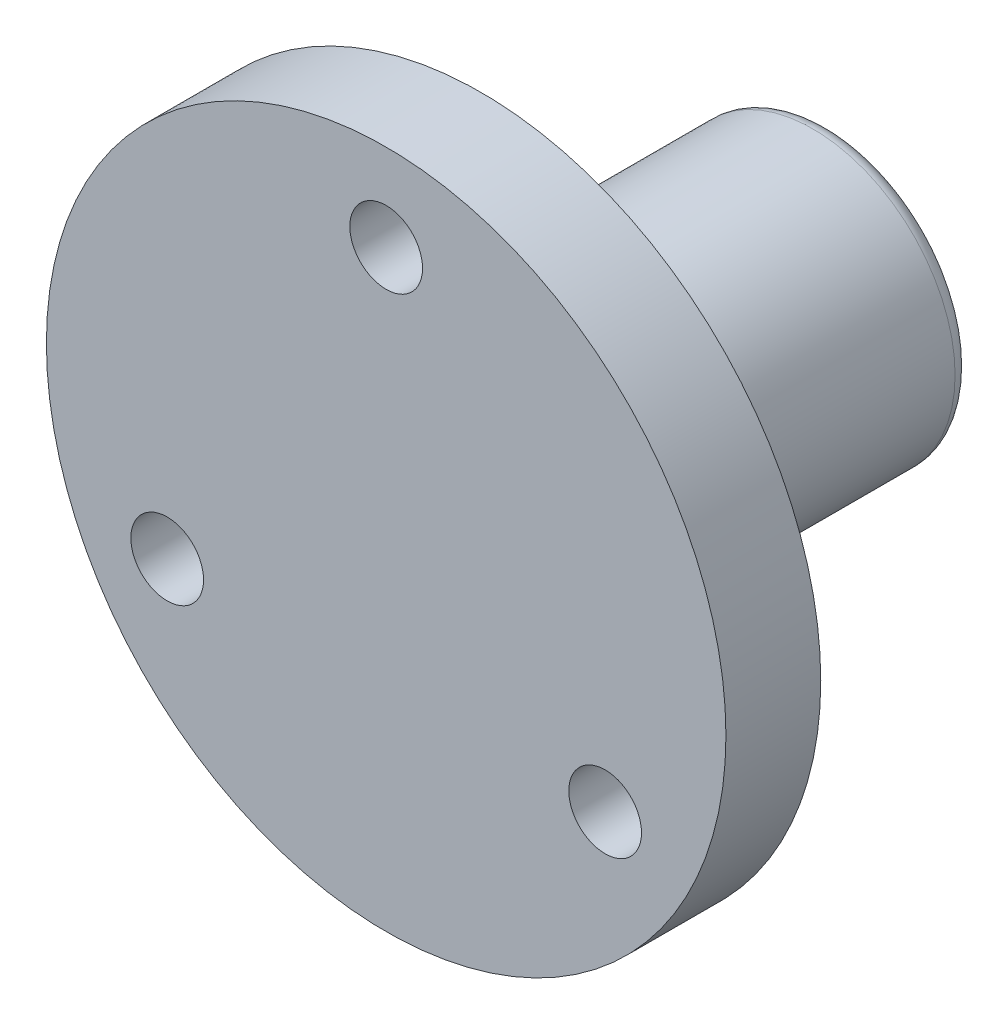
ISO-10303-21;
HEADER;
FILE_DESCRIPTION(('STEP AP214'),'2;1');
FILE_NAME('part.step','',(''),(''),'','','');
FILE_SCHEMA(('AUTOMOTIVE_DESIGN { 1 0 10303 214 1 1 1 1 }'));
ENDSEC;
DATA;
#1=APPLICATION_CONTEXT('core data for automotive mechanical design processes');
#2=APPLICATION_PROTOCOL_DEFINITION('international standard','automotive_design',2000,#1);
#3=PRODUCT_CONTEXT('',#1,'mechanical');
#4=PRODUCT('Part','Part','',(#3));
#5=PRODUCT_RELATED_PRODUCT_CATEGORY('part','',(#4));
#6=PRODUCT_DEFINITION_FORMATION('','',#4);
#7=PRODUCT_DEFINITION_CONTEXT('part definition',#1,'design');
#8=PRODUCT_DEFINITION('design','',#6,#7);
#9=PRODUCT_DEFINITION_SHAPE('','',#8);
#10=(LENGTH_UNIT() NAMED_UNIT(*) SI_UNIT(.MILLI.,.METRE.));
#11=(NAMED_UNIT(*) PLANE_ANGLE_UNIT() SI_UNIT($,.RADIAN.));
#12=(NAMED_UNIT(*) SI_UNIT($,.STERADIAN.) SOLID_ANGLE_UNIT());
#13=UNCERTAINTY_MEASURE_WITH_UNIT(LENGTH_MEASURE(1.E-05),#10,'distance_accuracy_value','');
#14=(GEOMETRIC_REPRESENTATION_CONTEXT(3) GLOBAL_UNCERTAINTY_ASSIGNED_CONTEXT((#13)) GLOBAL_UNIT_ASSIGNED_CONTEXT((#10,
#11,#12)) REPRESENTATION_CONTEXT('',''));
#15=CARTESIAN_POINT('',(0.,0.,0.));
#16=DIRECTION('',(0.,0.,1.));
#17=DIRECTION('',(1.,0.,0.));
#18=AXIS2_PLACEMENT_3D('',#15,#16,#17);
#19=CARTESIAN_POINT('',(26.8532032302755,-11.,3.));
#20=DIRECTION('',(0.,0.,-1.));
#21=DIRECTION('',(-1.,0.,0.));
#22=AXIS2_PLACEMENT_3D('',#19,#20,#21);
#23=CYLINDRICAL_SURFACE('',#22,1.15);
#24=CARTESIAN_POINT('',(26.8532032302755,-11.,3.));
#25=DIRECTION('',(0.,0.,1.));
#26=DIRECTION('',(1.,0.,0.));
#27=AXIS2_PLACEMENT_3D('',#24,#25,#26);
#28=CIRCLE('',#27,1.15);
#29=CARTESIAN_POINT('',(28.0032032302755,-11.,3.));
#30=VERTEX_POINT('',#29);
#31=EDGE_CURVE('E386',#30,#30,#28,.T.);
#32=ORIENTED_EDGE('',*,*,#31,.T.);
#33=EDGE_LOOP('',(#32));
#34=FACE_BOUND('',#33,.T.);
#35=CARTESIAN_POINT('',(26.8532032302755,-11.,1.));
#36=DIRECTION('',(0.,0.,-1.));
#37=DIRECTION('',(-1.,0.,0.));
#38=AXIS2_PLACEMENT_3D('',#35,#36,#37);
#39=CIRCLE('',#38,1.15);
#40=CARTESIAN_POINT('',(25.7032032302755,-11.,1.));
#41=VERTEX_POINT('',#40);
#42=EDGE_CURVE('E391',#41,#41,#39,.T.);
#43=ORIENTED_EDGE('',*,*,#42,.T.);
#44=EDGE_LOOP('',(#43));
#45=FACE_BOUND('',#44,.T.);
#46=ADVANCED_FACE('F45',(#34,#45),#23,.F.);
#47=CARTESIAN_POINT('',(19.925,0.99999999999999,3.));
#48=DIRECTION('',(0.,0.,-1.));
#49=DIRECTION('',(-1.,0.,0.));
#50=AXIS2_PLACEMENT_3D('',#47,#48,#49);
#51=CYLINDRICAL_SURFACE('',#50,1.15);
#52=CARTESIAN_POINT('',(19.925,0.99999999999999,3.));
#53=DIRECTION('',(0.,0.,1.));
#54=DIRECTION('',(1.,0.,0.));
#55=AXIS2_PLACEMENT_3D('',#52,#53,#54);
#56=CIRCLE('',#55,1.15);
#57=CARTESIAN_POINT('',(21.075,0.99999999999999,3.));
#58=VERTEX_POINT('',#57);
#59=EDGE_CURVE('E390',#58,#58,#56,.T.);
#60=ORIENTED_EDGE('',*,*,#59,.T.);
#61=EDGE_LOOP('',(#60));
#62=FACE_BOUND('',#61,.T.);
#63=CARTESIAN_POINT('',(19.925,0.99999999999999,1.));
#64=DIRECTION('',(0.,0.,-1.));
#65=DIRECTION('',(-1.,0.,0.));
#66=AXIS2_PLACEMENT_3D('',#63,#64,#65);
#67=CIRCLE('',#66,1.15);
#68=CARTESIAN_POINT('',(18.775,0.99999999999999,1.));
#69=VERTEX_POINT('',#68);
#70=EDGE_CURVE('E435',#69,#69,#67,.T.);
#71=ORIENTED_EDGE('',*,*,#70,.T.);
#72=EDGE_LOOP('',(#71));
#73=FACE_BOUND('',#72,.T.);
#74=ADVANCED_FACE('F464',(#62,#73),#51,.F.);
#75=CARTESIAN_POINT('',(12.9967967697245,-11.,3.));
#76=DIRECTION('',(0.,0.,-1.));
#77=DIRECTION('',(-1.,0.,0.));
#78=AXIS2_PLACEMENT_3D('',#75,#76,#77);
#79=CYLINDRICAL_SURFACE('',#78,1.15);
#80=CARTESIAN_POINT('',(12.9967967697245,-11.,3.));
#81=DIRECTION('',(0.,0.,1.));
#82=DIRECTION('',(1.,0.,0.));
#83=AXIS2_PLACEMENT_3D('',#80,#81,#82);
#84=CIRCLE('',#83,1.15);
#85=CARTESIAN_POINT('',(14.1467967697245,-11.,3.));
#86=VERTEX_POINT('',#85);
#87=EDGE_CURVE('E395',#86,#86,#84,.T.);
#88=ORIENTED_EDGE('',*,*,#87,.T.);
#89=EDGE_LOOP('',(#88));
#90=FACE_BOUND('',#89,.T.);
#91=CARTESIAN_POINT('',(12.9967967697245,-11.,1.));
#92=DIRECTION('',(0.,0.,-1.));
#93=DIRECTION('',(-1.,0.,0.));
#94=AXIS2_PLACEMENT_3D('',#91,#92,#93);
#95=CIRCLE('',#94,1.15);
#96=CARTESIAN_POINT('',(11.8467967697245,-11.,1.));
#97=VERTEX_POINT('',#96);
#98=EDGE_CURVE('E244',#97,#97,#95,.T.);
#99=ORIENTED_EDGE('',*,*,#98,.T.);
#100=EDGE_LOOP('',(#99));
#101=FACE_BOUND('',#100,.T.);
#102=ADVANCED_FACE('F470',(#90,#101),#79,.F.);
#103=CARTESIAN_POINT('',(19.925,-7.00000000000001,-11.));
#104=DIRECTION('',(0.,0.,1.));
#105=DIRECTION('',(1.,0.,0.));
#106=AXIS2_PLACEMENT_3D('',#103,#104,#105);
#107=CYLINDRICAL_SURFACE('',#106,4.5);
#108=CARTESIAN_POINT('',(19.925,-7.00000000000001,-10.5));
#109=DIRECTION('',(0.,0.,1.));
#110=DIRECTION('',(1.,0.,0.));
#111=AXIS2_PLACEMENT_3D('',#108,#109,#110);
#112=CIRCLE('',#111,4.5);
#113=CARTESIAN_POINT('',(24.425,-7.00000000000001,-10.5));
#114=VERTEX_POINT('',#113);
#115=EDGE_CURVE('E54',#114,#114,#112,.T.);
#116=ORIENTED_EDGE('',*,*,#115,.T.);
#117=EDGE_LOOP('',(#116));
#118=FACE_BOUND('',#117,.T.);
#119=CARTESIAN_POINT('',(19.925,-7.00000000000001,-0.999999999999994));
#120=DIRECTION('',(0.,0.,1.));
#121=DIRECTION('',(1.,0.,0.));
#122=AXIS2_PLACEMENT_3D('',#119,#120,#121);
#123=CIRCLE('',#122,4.5);
#124=CARTESIAN_POINT('',(24.425,-7.00000000000001,-0.999999999999994));
#125=VERTEX_POINT('',#124);
#126=EDGE_CURVE('E445',#125,#125,#123,.F.);
#127=ORIENTED_EDGE('',*,*,#126,.T.);
#128=EDGE_LOOP('',(#127));
#129=FACE_BOUND('',#128,.T.);
#130=ADVANCED_FACE('F452',(#118,#129),#107,.T.);
#131=CARTESIAN_POINT('',(19.925,-7.00000000000001,-11.));
#132=DIRECTION('',(0.,0.,1.));
#133=DIRECTION('',(1.,0.,0.));
#134=AXIS2_PLACEMENT_3D('',#131,#132,#133);
#135=PLANE('',#134);
#136=CARTESIAN_POINT('',(19.925,-7.00000000000001,-11.));
#137=DIRECTION('',(0.,0.,1.));
#138=DIRECTION('',(1.,0.,0.));
#139=AXIS2_PLACEMENT_3D('',#136,#137,#138);
#140=CIRCLE('',#139,4.);
#141=CARTESIAN_POINT('',(23.925,-7.00000000000001,-11.));
#142=VERTEX_POINT('',#141);
#143=EDGE_CURVE('E11',#142,#142,#140,.F.);
#144=ORIENTED_EDGE('',*,*,#143,.T.);
#145=EDGE_LOOP('',(#144));
#146=FACE_BOUND('',#145,.T.);
#147=DIRECTION('',(-1.,0.,0.));
#148=VECTOR('',#147,1.);
#149=CARTESIAN_POINT('',(18.1469868813107,-4.58366613445726,-11.));
#150=LINE('',#149,#148);
#151=CARTESIAN_POINT('',(21.7030131186893,-4.58366613445726,-11.));
#152=VERTEX_POINT('',#151);
#153=CARTESIAN_POINT('',(18.1469868813107,-4.58366613445726,-11.));
#154=VERTEX_POINT('',#153);
#155=EDGE_CURVE('E412',#152,#154,#150,.T.);
#156=ORIENTED_EDGE('',*,*,#155,.T.);
#157=CARTESIAN_POINT('',(19.925,-7.00000000000001,-11.));
#158=DIRECTION('',(0.,0.,1.));
#159=DIRECTION('',(1.,0.,0.));
#160=AXIS2_PLACEMENT_3D('',#157,#158,#159);
#161=CIRCLE('',#160,3.);
#162=EDGE_CURVE('E408',#154,#152,#161,.T.);
#163=ORIENTED_EDGE('',*,*,#162,.T.);
#164=EDGE_LOOP('',(#156,#163));
#165=FACE_BOUND('',#164,.T.);
#166=ADVANCED_FACE('F501',(#146,#165),#135,.F.);
#167=CARTESIAN_POINT('',(19.925,-7.00000000000001,-11.));
#168=DIRECTION('',(0.,0.,1.));
#169=DIRECTION('',(1.,0.,0.));
#170=AXIS2_PLACEMENT_3D('',#167,#168,#169);
#171=CYLINDRICAL_SURFACE('',#170,3.);
#172=CARTESIAN_POINT('',(19.925,-7.00000000000001,0.));
#173=DIRECTION('',(0.,0.,1.));
#174=DIRECTION('',(1.,0.,0.));
#175=AXIS2_PLACEMENT_3D('',#172,#173,#174);
#176=CIRCLE('',#175,3.);
#177=CARTESIAN_POINT('',(18.1469868813107,-4.58366613445726,0.));
#178=VERTEX_POINT('',#177);
#179=CARTESIAN_POINT('',(21.7030131186893,-4.58366613445726,0.));
#180=VERTEX_POINT('',#179);
#181=EDGE_CURVE('E404',#178,#180,#176,.T.);
#182=ORIENTED_EDGE('',*,*,#181,.T.);
#183=DIRECTION('',(0.,0.,1.));
#184=VECTOR('',#183,1.);
#185=CARTESIAN_POINT('',(21.7030131186893,-4.58366613445726,-11.));
#186=LINE('',#185,#184);
#187=EDGE_CURVE('E417',#152,#180,#186,.T.);
#188=ORIENTED_EDGE('',*,*,#187,.F.);
#189=ORIENTED_EDGE('',*,*,#162,.F.);
#190=DIRECTION('',(0.,0.,1.));
#191=VECTOR('',#190,1.);
#192=CARTESIAN_POINT('',(18.1469868813107,-4.58366613445726,-11.));
#193=LINE('',#192,#191);
#194=EDGE_CURVE('E424',#154,#178,#193,.T.);
#195=ORIENTED_EDGE('',*,*,#194,.T.);
#196=EDGE_LOOP('',(#182,#188,#189,#195));
#197=FACE_BOUND('',#196,.T.);
#198=ADVANCED_FACE('F497',(#197),#171,.F.);
#199=CARTESIAN_POINT('',(18.1469868813107,-4.58366613445726,-11.));
#200=DIRECTION('',(0.,1.,0.));
#201=DIRECTION('',(-1.,0.,0.));
#202=AXIS2_PLACEMENT_3D('',#199,#200,#201);
#203=PLANE('',#202);
#204=DIRECTION('',(-1.,0.,0.));
#205=VECTOR('',#204,1.);
#206=CARTESIAN_POINT('',(18.1469868813107,-4.58366613445726,0.));
#207=LINE('',#206,#205);
#208=EDGE_CURVE('E413',#180,#178,#207,.T.);
#209=ORIENTED_EDGE('',*,*,#208,.T.);
#210=ORIENTED_EDGE('',*,*,#194,.F.);
#211=ORIENTED_EDGE('',*,*,#155,.F.);
#212=ORIENTED_EDGE('',*,*,#187,.T.);
#213=EDGE_LOOP('',(#209,#210,#211,#212));
#214=FACE_BOUND('',#213,.T.);
#215=ADVANCED_FACE('F493',(#214),#203,.F.);
#216=CARTESIAN_POINT('',(19.925,-7.00000000000001,3.));
#217=DIRECTION('',(0.,0.,-1.));
#218=DIRECTION('',(-1.,0.,0.));
#219=AXIS2_PLACEMENT_3D('',#216,#217,#218);
#220=CYLINDRICAL_SURFACE('',#219,10.75);
#221=CARTESIAN_POINT('',(19.925,-7.00000000000001,3.));
#222=DIRECTION('',(0.,0.,1.));
#223=DIRECTION('',(1.,0.,0.));
#224=AXIS2_PLACEMENT_3D('',#221,#222,#223);
#225=CIRCLE('',#224,10.75);
#226=CARTESIAN_POINT('',(30.675,-7.00000000000001,3.));
#227=VERTEX_POINT('',#226);
#228=EDGE_CURVE('E400',#227,#227,#225,.T.);
#229=ORIENTED_EDGE('',*,*,#228,.F.);
#230=EDGE_LOOP('',(#229));
#231=FACE_BOUND('',#230,.T.);
#232=CARTESIAN_POINT('',(19.925,-7.00000000000001,0.));
#233=DIRECTION('',(0.,0.,1.));
#234=DIRECTION('',(1.,0.,0.));
#235=AXIS2_PLACEMENT_3D('',#232,#233,#234);
#236=CIRCLE('',#235,10.75);
#237=CARTESIAN_POINT('',(30.675,-7.00000000000001,0.));
#238=VERTEX_POINT('',#237);
#239=EDGE_CURVE('E399',#238,#238,#236,.T.);
#240=ORIENTED_EDGE('',*,*,#239,.T.);
#241=EDGE_LOOP('',(#240));
#242=FACE_BOUND('',#241,.T.);
#243=ADVANCED_FACE('F489',(#231,#242),#220,.T.);
#244=CARTESIAN_POINT('',(19.925,-7.00000000000001,0.));
#245=DIRECTION('',(0.,0.,1.));
#246=DIRECTION('',(1.,0.,0.));
#247=AXIS2_PLACEMENT_3D('',#244,#245,#246);
#248=PLANE('',#247);
#249=CARTESIAN_POINT('',(19.925,-7.00000000000001,0.));
#250=DIRECTION('',(0.,0.,1.));
#251=DIRECTION('',(1.,0.,0.));
#252=AXIS2_PLACEMENT_3D('',#249,#250,#251);
#253=CIRCLE('',#252,5.50000000000001);
#254=CARTESIAN_POINT('',(25.425,-7.00000000000001,0.));
#255=VERTEX_POINT('',#254);
#256=EDGE_CURVE('E428',#255,#255,#253,.T.);
#257=ORIENTED_EDGE('',*,*,#256,.T.);
#258=EDGE_LOOP('',(#257));
#259=FACE_BOUND('',#258,.T.);
#260=DIRECTION('',(1.,0.,0.));
#261=VECTOR('',#260,1.);
#262=CARTESIAN_POINT('',(25.5830326380583,-8.80000000000005,0.));
#263=LINE('',#262,#261);
#264=CARTESIAN_POINT('',(25.5830326380583,-8.80000000000005,0.));
#265=VERTEX_POINT('',#264);
#266=CARTESIAN_POINT('',(28.1233738224927,-8.80000000000004,0.));
#267=VERTEX_POINT('',#266);
#268=EDGE_CURVE('E227',#265,#267,#263,.T.);
#269=ORIENTED_EDGE('',*,*,#268,.F.);
#270=DIRECTION('',(0.499999999999995,0.866025403784441,0.));
#271=VECTOR('',#270,1.);
#272=CARTESIAN_POINT('',(24.3128620458411,-11.0000000000001,0.));
#273=LINE('',#272,#271);
#274=CARTESIAN_POINT('',(24.3128620458411,-11.0000000000001,0.));
#275=VERTEX_POINT('',#274);
#276=EDGE_CURVE('E61',#275,#265,#273,.T.);
#277=ORIENTED_EDGE('',*,*,#276,.F.);
#278=DIRECTION('',(-0.500000000000007,0.866025403784435,0.));
#279=VECTOR('',#278,1.);
#280=CARTESIAN_POINT('',(25.5830326380583,-13.2000000000001,0.));
#281=LINE('',#280,#279);
#282=CARTESIAN_POINT('',(25.5830326380583,-13.2000000000001,0.));
#283=VERTEX_POINT('',#282);
#284=EDGE_CURVE('E207',#283,#275,#281,.T.);
#285=ORIENTED_EDGE('',*,*,#284,.F.);
#286=DIRECTION('',(-1.,0.,0.));
#287=VECTOR('',#286,1.);
#288=CARTESIAN_POINT('',(28.1233738224927,-13.2,0.));
#289=LINE('',#288,#287);
#290=CARTESIAN_POINT('',(28.1233738224927,-13.2,0.));
#291=VERTEX_POINT('',#290);
#292=EDGE_CURVE('E211',#291,#283,#289,.T.);
#293=ORIENTED_EDGE('',*,*,#292,.F.);
#294=DIRECTION('',(-0.499999999999995,-0.866025403784442,0.));
#295=VECTOR('',#294,1.);
#296=CARTESIAN_POINT('',(29.3935444147098,-11.,0.));
#297=LINE('',#296,#295);
#298=CARTESIAN_POINT('',(29.3935444147098,-11.,0.));
#299=VERTEX_POINT('',#298);
#300=EDGE_CURVE('E234',#299,#291,#297,.T.);
#301=ORIENTED_EDGE('',*,*,#300,.F.);
#302=DIRECTION('',(0.500000000000004,-0.866025403784436,0.));
#303=VECTOR('',#302,1.);
#304=CARTESIAN_POINT('',(28.1233738224927,-8.80000000000004,0.));
#305=LINE('',#304,#303);
#306=EDGE_CURVE('E230',#267,#299,#305,.T.);
#307=ORIENTED_EDGE('',*,*,#306,.F.);
#308=EDGE_LOOP('',(#269,#277,#285,#293,#301,#307));
#309=FACE_BOUND('',#308,.T.);
#310=DIRECTION('',(-0.5,-0.866025403784439,0.));
#311=VECTOR('',#310,1.);
#312=CARTESIAN_POINT('',(22.4653411844344,0.99999999999999,0.));
#313=LINE('',#312,#311);
#314=CARTESIAN_POINT('',(22.4653411844344,0.99999999999999,0.));
#315=VERTEX_POINT('',#314);
#316=CARTESIAN_POINT('',(21.1951705922172,-1.20000000000001,0.));
#317=VERTEX_POINT('',#316);
#318=EDGE_CURVE('E293',#315,#317,#313,.T.);
#319=ORIENTED_EDGE('',*,*,#318,.F.);
#320=DIRECTION('',(0.5,-0.866025403784439,0.));
#321=VECTOR('',#320,1.);
#322=CARTESIAN_POINT('',(21.1951705922172,3.19999999999999,0.));
#323=LINE('',#322,#321);
#324=CARTESIAN_POINT('',(21.1951705922172,3.19999999999999,0.));
#325=VERTEX_POINT('',#324);
#326=EDGE_CURVE('E69',#325,#315,#323,.T.);
#327=ORIENTED_EDGE('',*,*,#326,.F.);
#328=DIRECTION('',(1.,0.,0.));
#329=VECTOR('',#328,1.);
#330=CARTESIAN_POINT('',(18.6548294077828,3.19999999999999,0.));
#331=LINE('',#330,#329);
#332=CARTESIAN_POINT('',(18.6548294077828,3.19999999999999,0.));
#333=VERTEX_POINT('',#332);
#334=EDGE_CURVE('E276',#333,#325,#331,.T.);
#335=ORIENTED_EDGE('',*,*,#334,.F.);
#336=DIRECTION('',(0.500000000000001,0.866025403784438,0.));
#337=VECTOR('',#336,1.);
#338=CARTESIAN_POINT('',(17.3846588155656,0.999999999999992,0.));
#339=LINE('',#338,#337);
#340=CARTESIAN_POINT('',(17.3846588155656,0.999999999999992,0.));
#341=VERTEX_POINT('',#340);
#342=EDGE_CURVE('E280',#341,#333,#339,.T.);
#343=ORIENTED_EDGE('',*,*,#342,.F.);
#344=DIRECTION('',(-0.5,0.866025403784439,0.));
#345=VECTOR('',#344,1.);
#346=CARTESIAN_POINT('',(18.6548294077828,-1.20000000000001,0.));
#347=LINE('',#346,#345);
#348=CARTESIAN_POINT('',(18.6548294077828,-1.20000000000001,0.));
#349=VERTEX_POINT('',#348);
#350=EDGE_CURVE('E285',#349,#341,#347,.T.);
#351=ORIENTED_EDGE('',*,*,#350,.F.);
#352=DIRECTION('',(-1.,0.,0.));
#353=VECTOR('',#352,1.);
#354=CARTESIAN_POINT('',(21.1951705922172,-1.20000000000001,0.));
#355=LINE('',#354,#353);
#356=EDGE_CURVE('E289',#317,#349,#355,.T.);
#357=ORIENTED_EDGE('',*,*,#356,.F.);
#358=EDGE_LOOP('',(#319,#327,#335,#343,#351,#357));
#359=FACE_BOUND('',#358,.T.);
#360=DIRECTION('',(0.500000000000001,-0.866025403784438,0.));
#361=VECTOR('',#360,1.);
#362=CARTESIAN_POINT('',(14.2669673619417,-8.80000000000004,0.));
#363=LINE('',#362,#361);
#364=CARTESIAN_POINT('',(14.2669673619417,-8.80000000000004,0.));
#365=VERTEX_POINT('',#364);
#366=CARTESIAN_POINT('',(15.5371379541589,-11.,0.));
#367=VERTEX_POINT('',#366);
#368=EDGE_CURVE('E358',#365,#367,#363,.T.);
#369=ORIENTED_EDGE('',*,*,#368,.F.);
#370=DIRECTION('',(1.,0.,0.));
#371=VECTOR('',#370,1.);
#372=CARTESIAN_POINT('',(11.7266261775073,-8.80000000000004,0.));
#373=LINE('',#372,#371);
#374=CARTESIAN_POINT('',(11.7266261775073,-8.80000000000004,0.));
#375=VERTEX_POINT('',#374);
#376=EDGE_CURVE('E275',#375,#365,#373,.T.);
#377=ORIENTED_EDGE('',*,*,#376,.F.);
#378=DIRECTION('',(0.499999999999999,0.866025403784439,0.));
#379=VECTOR('',#378,1.);
#380=CARTESIAN_POINT('',(10.4564555852901,-11.,0.));
#381=LINE('',#380,#379);
#382=CARTESIAN_POINT('',(10.4564555852901,-11.,0.));
#383=VERTEX_POINT('',#382);
#384=EDGE_CURVE('E341',#383,#375,#381,.T.);
#385=ORIENTED_EDGE('',*,*,#384,.F.);
#386=DIRECTION('',(-0.500000000000001,0.866025403784438,0.));
#387=VECTOR('',#386,1.);
#388=CARTESIAN_POINT('',(11.7266261775073,-13.2000000000001,0.));
#389=LINE('',#388,#387);
#390=CARTESIAN_POINT('',(11.7266261775073,-13.2000000000001,0.));
#391=VERTEX_POINT('',#390);
#392=EDGE_CURVE('E345',#391,#383,#389,.T.);
#393=ORIENTED_EDGE('',*,*,#392,.F.);
#394=DIRECTION('',(-1.,0.,0.));
#395=VECTOR('',#394,1.);
#396=CARTESIAN_POINT('',(14.2669673619417,-13.2,0.));
#397=LINE('',#396,#395);
#398=CARTESIAN_POINT('',(14.2669673619417,-13.2,0.));
#399=VERTEX_POINT('',#398);
#400=EDGE_CURVE('E350',#399,#391,#397,.T.);
#401=ORIENTED_EDGE('',*,*,#400,.F.);
#402=DIRECTION('',(-0.499999999999999,-0.866025403784439,0.));
#403=VECTOR('',#402,1.);
#404=CARTESIAN_POINT('',(15.5371379541589,-11.,0.));
#405=LINE('',#404,#403);
#406=EDGE_CURVE('E354',#367,#399,#405,.T.);
#407=ORIENTED_EDGE('',*,*,#406,.F.);
#408=EDGE_LOOP('',(#369,#377,#385,#393,#401,#407));
#409=FACE_BOUND('',#408,.T.);
#410=ORIENTED_EDGE('',*,*,#239,.F.);
#411=EDGE_LOOP('',(#410));
#412=FACE_BOUND('',#411,.T.);
#413=ADVANCED_FACE('F485',(#259,#309,#359,#409,#412),#248,.F.);
#414=CARTESIAN_POINT('',(19.925,-7.00000000000001,3.));
#415=DIRECTION('',(0.,0.,1.));
#416=DIRECTION('',(1.,0.,0.));
#417=AXIS2_PLACEMENT_3D('',#414,#415,#416);
#418=PLANE('',#417);
#419=ORIENTED_EDGE('',*,*,#59,.F.);
#420=EDGE_LOOP('',(#419));
#421=FACE_BOUND('',#420,.T.);
#422=ORIENTED_EDGE('',*,*,#228,.T.);
#423=EDGE_LOOP('',(#422));
#424=FACE_BOUND('',#423,.T.);
#425=ORIENTED_EDGE('',*,*,#87,.F.);
#426=EDGE_LOOP('',(#425));
#427=FACE_BOUND('',#426,.T.);
#428=ORIENTED_EDGE('',*,*,#31,.F.);
#429=EDGE_LOOP('',(#428));
#430=FACE_BOUND('',#429,.T.);
#431=ADVANCED_FACE('F481',(#421,#424,#427,#430),#418,.T.);
#432=ORIENTED_EDGE('',*,*,#181,.F.);
#433=ORIENTED_EDGE('',*,*,#208,.F.);
#434=EDGE_LOOP('',(#432,#433));
#435=FACE_BOUND('',#434,.T.);
#436=ADVANCED_FACE('F484',(#435),#248,.F.);
#437=CARTESIAN_POINT('',(11.7266261775073,-8.80000000000004,1.));
#438=DIRECTION('',(0.,1.,0.));
#439=DIRECTION('',(-1.,0.,0.));
#440=AXIS2_PLACEMENT_3D('',#437,#438,#439);
#441=PLANE('',#440);
#442=ORIENTED_EDGE('',*,*,#376,.T.);
#443=DIRECTION('',(0.,0.,-1.));
#444=VECTOR('',#443,1.);
#445=CARTESIAN_POINT('',(14.2669673619417,-8.80000000000004,1.));
#446=LINE('',#445,#444);
#447=CARTESIAN_POINT('',(14.2669673619417,-8.80000000000004,1.));
#448=VERTEX_POINT('',#447);
#449=EDGE_CURVE('E321',#448,#365,#446,.T.);
#450=ORIENTED_EDGE('',*,*,#449,.F.);
#451=DIRECTION('',(1.,0.,0.));
#452=VECTOR('',#451,1.);
#453=CARTESIAN_POINT('',(11.7266261775073,-8.80000000000004,1.));
#454=LINE('',#453,#452);
#455=CARTESIAN_POINT('',(11.7266261775073,-8.80000000000004,1.));
#456=VERTEX_POINT('',#455);
#457=EDGE_CURVE('E346',#456,#448,#454,.T.);
#458=ORIENTED_EDGE('',*,*,#457,.F.);
#459=DIRECTION('',(0.,0.,-1.));
#460=VECTOR('',#459,1.);
#461=CARTESIAN_POINT('',(11.7266261775073,-8.80000000000004,1.));
#462=LINE('',#461,#460);
#463=EDGE_CURVE('E338',#456,#375,#462,.T.);
#464=ORIENTED_EDGE('',*,*,#463,.T.);
#465=EDGE_LOOP('',(#442,#450,#458,#464));
#466=FACE_BOUND('',#465,.T.);
#467=ADVANCED_FACE('F546',(#466),#441,.F.);
#468=CARTESIAN_POINT('',(10.4564555852901,-11.,1.));
#469=DIRECTION('',(-0.866025403784439,0.499999999999999,0.));
#470=DIRECTION('',(-0.499999999999999,-0.866025403784439,0.));
#471=AXIS2_PLACEMENT_3D('',#468,#469,#470);
#472=PLANE('',#471);
#473=ORIENTED_EDGE('',*,*,#384,.T.);
#474=ORIENTED_EDGE('',*,*,#463,.F.);
#475=DIRECTION('',(0.499999999999999,0.866025403784439,0.));
#476=VECTOR('',#475,1.);
#477=CARTESIAN_POINT('',(10.4564555852901,-11.,1.));
#478=LINE('',#477,#476);
#479=CARTESIAN_POINT('',(10.4564555852901,-11.,1.));
#480=VERTEX_POINT('',#479);
#481=EDGE_CURVE('E325',#480,#456,#478,.T.);
#482=ORIENTED_EDGE('',*,*,#481,.F.);
#483=DIRECTION('',(0.,0.,-1.));
#484=VECTOR('',#483,1.);
#485=CARTESIAN_POINT('',(10.4564555852901,-11.,1.));
#486=LINE('',#485,#484);
#487=EDGE_CURVE('E335',#480,#383,#486,.T.);
#488=ORIENTED_EDGE('',*,*,#487,.T.);
#489=EDGE_LOOP('',(#473,#474,#482,#488));
#490=FACE_BOUND('',#489,.T.);
#491=ADVANCED_FACE('F553',(#490),#472,.F.);
#492=CARTESIAN_POINT('',(11.7266261775073,-13.2000000000001,1.));
#493=DIRECTION('',(-0.866025403784438,-0.500000000000001,0.));
#494=DIRECTION('',(0.500000000000001,-0.866025403784438,0.));
#495=AXIS2_PLACEMENT_3D('',#492,#493,#494);
#496=PLANE('',#495);
#497=ORIENTED_EDGE('',*,*,#392,.T.);
#498=ORIENTED_EDGE('',*,*,#487,.F.);
#499=DIRECTION('',(-0.500000000000001,0.866025403784438,0.));
#500=VECTOR('',#499,1.);
#501=CARTESIAN_POINT('',(11.7266261775073,-13.2000000000001,1.));
#502=LINE('',#501,#500);
#503=CARTESIAN_POINT('',(11.7266261775073,-13.2000000000001,1.));
#504=VERTEX_POINT('',#503);
#505=EDGE_CURVE('E367',#504,#480,#502,.T.);
#506=ORIENTED_EDGE('',*,*,#505,.F.);
#507=DIRECTION('',(0.,0.,-1.));
#508=VECTOR('',#507,1.);
#509=CARTESIAN_POINT('',(11.7266261775073,-13.2000000000001,1.));
#510=LINE('',#509,#508);
#511=EDGE_CURVE('E332',#504,#391,#510,.T.);
#512=ORIENTED_EDGE('',*,*,#511,.T.);
#513=EDGE_LOOP('',(#497,#498,#506,#512));
#514=FACE_BOUND('',#513,.T.);
#515=ADVANCED_FACE('F561',(#514),#496,.F.);
#516=CARTESIAN_POINT('',(14.2669673619417,-13.2,1.));
#517=DIRECTION('',(0.,-1.,0.));
#518=DIRECTION('',(1.,0.,0.));
#519=AXIS2_PLACEMENT_3D('',#516,#517,#518);
#520=PLANE('',#519);
#521=ORIENTED_EDGE('',*,*,#400,.T.);
#522=ORIENTED_EDGE('',*,*,#511,.F.);
#523=DIRECTION('',(-1.,0.,0.));
#524=VECTOR('',#523,1.);
#525=CARTESIAN_POINT('',(14.2669673619417,-13.2,1.));
#526=LINE('',#525,#524);
#527=CARTESIAN_POINT('',(14.2669673619417,-13.2,1.));
#528=VERTEX_POINT('',#527);
#529=EDGE_CURVE('E371',#528,#504,#526,.T.);
#530=ORIENTED_EDGE('',*,*,#529,.F.);
#531=DIRECTION('',(0.,0.,-1.));
#532=VECTOR('',#531,1.);
#533=CARTESIAN_POINT('',(14.2669673619417,-13.2,1.));
#534=LINE('',#533,#532);
#535=EDGE_CURVE('E329',#528,#399,#534,.T.);
#536=ORIENTED_EDGE('',*,*,#535,.T.);
#537=EDGE_LOOP('',(#521,#522,#530,#536));
#538=FACE_BOUND('',#537,.T.);
#539=ADVANCED_FACE('F568',(#538),#520,.F.);
#540=CARTESIAN_POINT('',(15.5371379541589,-11.,1.));
#541=DIRECTION('',(0.866025403784439,-0.499999999999999,0.));
#542=DIRECTION('',(0.499999999999999,0.866025403784439,0.));
#543=AXIS2_PLACEMENT_3D('',#540,#541,#542);
#544=PLANE('',#543);
#545=ORIENTED_EDGE('',*,*,#406,.T.);
#546=ORIENTED_EDGE('',*,*,#535,.F.);
#547=DIRECTION('',(-0.499999999999999,-0.866025403784439,0.));
#548=VECTOR('',#547,1.);
#549=CARTESIAN_POINT('',(15.5371379541589,-11.,1.));
#550=LINE('',#549,#548);
#551=CARTESIAN_POINT('',(15.5371379541589,-11.,1.));
#552=VERTEX_POINT('',#551);
#553=EDGE_CURVE('E375',#552,#528,#550,.T.);
#554=ORIENTED_EDGE('',*,*,#553,.F.);
#555=DIRECTION('',(0.,0.,-1.));
#556=VECTOR('',#555,1.);
#557=CARTESIAN_POINT('',(15.5371379541589,-11.,1.));
#558=LINE('',#557,#556);
#559=EDGE_CURVE('E326',#552,#367,#558,.T.);
#560=ORIENTED_EDGE('',*,*,#559,.T.);
#561=EDGE_LOOP('',(#545,#546,#554,#560));
#562=FACE_BOUND('',#561,.T.);
#563=ADVANCED_FACE('F576',(#562),#544,.F.);
#564=CARTESIAN_POINT('',(14.2669673619417,-8.80000000000004,1.));
#565=DIRECTION('',(0.866025403784438,0.500000000000001,0.));
#566=DIRECTION('',(-0.500000000000001,0.866025403784438,0.));
#567=AXIS2_PLACEMENT_3D('',#564,#565,#566);
#568=PLANE('',#567);
#569=ORIENTED_EDGE('',*,*,#368,.T.);
#570=ORIENTED_EDGE('',*,*,#559,.F.);
#571=DIRECTION('',(0.500000000000001,-0.866025403784438,0.));
#572=VECTOR('',#571,1.);
#573=CARTESIAN_POINT('',(14.2669673619417,-8.80000000000004,1.));
#574=LINE('',#573,#572);
#575=EDGE_CURVE('E379',#448,#552,#574,.T.);
#576=ORIENTED_EDGE('',*,*,#575,.F.);
#577=ORIENTED_EDGE('',*,*,#449,.T.);
#578=EDGE_LOOP('',(#569,#570,#576,#577));
#579=FACE_BOUND('',#578,.T.);
#580=ADVANCED_FACE('F584',(#579),#568,.F.);
#581=CARTESIAN_POINT('',(0.,0.,1.));
#582=DIRECTION('',(0.,0.,-1.));
#583=DIRECTION('',(-1.,0.,0.));
#584=AXIS2_PLACEMENT_3D('',#581,#582,#583);
#585=PLANE('',#584);
#586=ORIENTED_EDGE('',*,*,#98,.F.);
#587=EDGE_LOOP('',(#586));
#588=FACE_BOUND('',#587,.T.);
#589=ORIENTED_EDGE('',*,*,#457,.T.);
#590=ORIENTED_EDGE('',*,*,#575,.T.);
#591=ORIENTED_EDGE('',*,*,#553,.T.);
#592=ORIENTED_EDGE('',*,*,#529,.T.);
#593=ORIENTED_EDGE('',*,*,#505,.T.);
#594=ORIENTED_EDGE('',*,*,#481,.T.);
#595=EDGE_LOOP('',(#589,#590,#591,#592,#593,#594));
#596=FACE_BOUND('',#595,.T.);
#597=ADVANCED_FACE('F475',(#588,#596),#585,.T.);
#598=CARTESIAN_POINT('',(21.1951705922172,3.19999999999999,1.));
#599=DIRECTION('',(0.866025403784439,0.5,0.));
#600=DIRECTION('',(-0.5,0.866025403784439,0.));
#601=AXIS2_PLACEMENT_3D('',#598,#599,#600);
#602=PLANE('',#601);
#603=ORIENTED_EDGE('',*,*,#326,.T.);
#604=DIRECTION('',(0.,0.,-1.));
#605=VECTOR('',#604,1.);
#606=CARTESIAN_POINT('',(22.4653411844344,0.99999999999999,1.));
#607=LINE('',#606,#605);
#608=CARTESIAN_POINT('',(22.4653411844344,0.99999999999999,1.));
#609=VERTEX_POINT('',#608);
#610=EDGE_CURVE('E256',#609,#315,#607,.T.);
#611=ORIENTED_EDGE('',*,*,#610,.F.);
#612=DIRECTION('',(0.5,-0.866025403784439,0.));
#613=VECTOR('',#612,1.);
#614=CARTESIAN_POINT('',(21.1951705922172,3.19999999999999,1.));
#615=LINE('',#614,#613);
#616=CARTESIAN_POINT('',(21.1951705922172,3.19999999999999,1.));
#617=VERTEX_POINT('',#616);
#618=EDGE_CURVE('E281',#617,#609,#615,.T.);
#619=ORIENTED_EDGE('',*,*,#618,.F.);
#620=DIRECTION('',(0.,0.,-1.));
#621=VECTOR('',#620,1.);
#622=CARTESIAN_POINT('',(21.1951705922172,3.19999999999999,1.));
#623=LINE('',#622,#621);
#624=EDGE_CURVE('E272',#617,#325,#623,.T.);
#625=ORIENTED_EDGE('',*,*,#624,.T.);
#626=EDGE_LOOP('',(#603,#611,#619,#625));
#627=FACE_BOUND('',#626,.T.);
#628=ADVANCED_FACE('F599',(#627),#602,.F.);
#629=CARTESIAN_POINT('',(18.6548294077828,3.19999999999999,1.));
#630=DIRECTION('',(0.,1.,0.));
#631=DIRECTION('',(-1.,0.,0.));
#632=AXIS2_PLACEMENT_3D('',#629,#630,#631);
#633=PLANE('',#632);
#634=ORIENTED_EDGE('',*,*,#334,.T.);
#635=ORIENTED_EDGE('',*,*,#624,.F.);
#636=DIRECTION('',(1.,0.,0.));
#637=VECTOR('',#636,1.);
#638=CARTESIAN_POINT('',(18.6548294077828,3.19999999999999,1.));
#639=LINE('',#638,#637);
#640=CARTESIAN_POINT('',(18.6548294077828,3.19999999999999,1.));
#641=VERTEX_POINT('',#640);
#642=EDGE_CURVE('E259',#641,#617,#639,.T.);
#643=ORIENTED_EDGE('',*,*,#642,.F.);
#644=DIRECTION('',(0.,0.,-1.));
#645=VECTOR('',#644,1.);
#646=CARTESIAN_POINT('',(18.6548294077828,3.19999999999999,1.));
#647=LINE('',#646,#645);
#648=EDGE_CURVE('E269',#641,#333,#647,.T.);
#649=ORIENTED_EDGE('',*,*,#648,.T.);
#650=EDGE_LOOP('',(#634,#635,#643,#649));
#651=FACE_BOUND('',#650,.T.);
#652=ADVANCED_FACE('F606',(#651),#633,.F.);
#653=CARTESIAN_POINT('',(17.3846588155656,0.999999999999992,1.));
#654=DIRECTION('',(-0.866025403784438,0.500000000000001,0.));
#655=DIRECTION('',(-0.500000000000001,-0.866025403784438,0.));
#656=AXIS2_PLACEMENT_3D('',#653,#654,#655);
#657=PLANE('',#656);
#658=ORIENTED_EDGE('',*,*,#342,.T.);
#659=ORIENTED_EDGE('',*,*,#648,.F.);
#660=DIRECTION('',(0.500000000000001,0.866025403784438,0.));
#661=VECTOR('',#660,1.);
#662=CARTESIAN_POINT('',(17.3846588155656,0.999999999999992,1.));
#663=LINE('',#662,#661);
#664=CARTESIAN_POINT('',(17.3846588155656,0.999999999999992,1.));
#665=VERTEX_POINT('',#664);
#666=EDGE_CURVE('E302',#665,#641,#663,.T.);
#667=ORIENTED_EDGE('',*,*,#666,.F.);
#668=DIRECTION('',(0.,0.,-1.));
#669=VECTOR('',#668,1.);
#670=CARTESIAN_POINT('',(17.3846588155656,0.999999999999992,1.));
#671=LINE('',#670,#669);
#672=EDGE_CURVE('E266',#665,#341,#671,.T.);
#673=ORIENTED_EDGE('',*,*,#672,.T.);
#674=EDGE_LOOP('',(#658,#659,#667,#673));
#675=FACE_BOUND('',#674,.T.);
#676=ADVANCED_FACE('F613',(#675),#657,.F.);
#677=CARTESIAN_POINT('',(18.6548294077828,-1.20000000000001,1.));
#678=DIRECTION('',(-0.866025403784439,-0.5,0.));
#679=DIRECTION('',(0.5,-0.866025403784439,0.));
#680=AXIS2_PLACEMENT_3D('',#677,#678,#679);
#681=PLANE('',#680);
#682=ORIENTED_EDGE('',*,*,#350,.T.);
#683=ORIENTED_EDGE('',*,*,#672,.F.);
#684=DIRECTION('',(-0.5,0.866025403784439,0.));
#685=VECTOR('',#684,1.);
#686=CARTESIAN_POINT('',(18.6548294077828,-1.20000000000001,1.));
#687=LINE('',#686,#685);
#688=CARTESIAN_POINT('',(18.6548294077828,-1.20000000000001,1.));
#689=VERTEX_POINT('',#688);
#690=EDGE_CURVE('E306',#689,#665,#687,.T.);
#691=ORIENTED_EDGE('',*,*,#690,.F.);
#692=DIRECTION('',(0.,0.,-1.));
#693=VECTOR('',#692,1.);
#694=CARTESIAN_POINT('',(18.6548294077828,-1.20000000000001,1.));
#695=LINE('',#694,#693);
#696=EDGE_CURVE('E263',#689,#349,#695,.T.);
#697=ORIENTED_EDGE('',*,*,#696,.T.);
#698=EDGE_LOOP('',(#682,#683,#691,#697));
#699=FACE_BOUND('',#698,.T.);
#700=ADVANCED_FACE('F621',(#699),#681,.F.);
#701=CARTESIAN_POINT('',(21.1951705922172,-1.20000000000001,1.));
#702=DIRECTION('',(0.,-1.,0.));
#703=DIRECTION('',(1.,0.,0.));
#704=AXIS2_PLACEMENT_3D('',#701,#702,#703);
#705=PLANE('',#704);
#706=ORIENTED_EDGE('',*,*,#356,.T.);
#707=ORIENTED_EDGE('',*,*,#696,.F.);
#708=DIRECTION('',(-1.,0.,0.));
#709=VECTOR('',#708,1.);
#710=CARTESIAN_POINT('',(21.1951705922172,-1.20000000000001,1.));
#711=LINE('',#710,#709);
#712=CARTESIAN_POINT('',(21.1951705922172,-1.20000000000001,1.));
#713=VERTEX_POINT('',#712);
#714=EDGE_CURVE('E310',#713,#689,#711,.T.);
#715=ORIENTED_EDGE('',*,*,#714,.F.);
#716=DIRECTION('',(0.,0.,-1.));
#717=VECTOR('',#716,1.);
#718=CARTESIAN_POINT('',(21.1951705922172,-1.20000000000001,1.));
#719=LINE('',#718,#717);
#720=EDGE_CURVE('E260',#713,#317,#719,.T.);
#721=ORIENTED_EDGE('',*,*,#720,.T.);
#722=EDGE_LOOP('',(#706,#707,#715,#721));
#723=FACE_BOUND('',#722,.T.);
#724=ADVANCED_FACE('F629',(#723),#705,.F.);
#725=CARTESIAN_POINT('',(22.4653411844344,0.99999999999999,1.));
#726=DIRECTION('',(0.866025403784439,-0.5,0.));
#727=DIRECTION('',(0.5,0.866025403784439,0.));
#728=AXIS2_PLACEMENT_3D('',#725,#726,#727);
#729=PLANE('',#728);
#730=ORIENTED_EDGE('',*,*,#318,.T.);
#731=ORIENTED_EDGE('',*,*,#720,.F.);
#732=DIRECTION('',(-0.5,-0.866025403784439,0.));
#733=VECTOR('',#732,1.);
#734=CARTESIAN_POINT('',(22.4653411844344,0.99999999999999,1.));
#735=LINE('',#734,#733);
#736=EDGE_CURVE('E314',#609,#713,#735,.T.);
#737=ORIENTED_EDGE('',*,*,#736,.F.);
#738=ORIENTED_EDGE('',*,*,#610,.T.);
#739=EDGE_LOOP('',(#730,#731,#737,#738));
#740=FACE_BOUND('',#739,.T.);
#741=ADVANCED_FACE('F637',(#740),#729,.F.);
#742=CARTESIAN_POINT('',(0.,0.,1.));
#743=DIRECTION('',(0.,0.,-1.));
#744=DIRECTION('',(-1.,0.,0.));
#745=AXIS2_PLACEMENT_3D('',#742,#743,#744);
#746=PLANE('',#745);
#747=ORIENTED_EDGE('',*,*,#70,.F.);
#748=EDGE_LOOP('',(#747));
#749=FACE_BOUND('',#748,.T.);
#750=ORIENTED_EDGE('',*,*,#618,.T.);
#751=ORIENTED_EDGE('',*,*,#736,.T.);
#752=ORIENTED_EDGE('',*,*,#714,.T.);
#753=ORIENTED_EDGE('',*,*,#690,.T.);
#754=ORIENTED_EDGE('',*,*,#666,.T.);
#755=ORIENTED_EDGE('',*,*,#642,.T.);
#756=EDGE_LOOP('',(#750,#751,#752,#753,#754,#755));
#757=FACE_BOUND('',#756,.T.);
#758=ADVANCED_FACE('F645',(#749,#757),#746,.T.);
#759=CARTESIAN_POINT('',(24.3128620458411,-11.0000000000001,1.));
#760=DIRECTION('',(-0.866025403784441,0.499999999999995,0.));
#761=DIRECTION('',(-0.499999999999995,-0.866025403784441,0.));
#762=AXIS2_PLACEMENT_3D('',#759,#760,#761);
#763=PLANE('',#762);
#764=ORIENTED_EDGE('',*,*,#276,.T.);
#765=DIRECTION('',(0.,0.,-1.));
#766=VECTOR('',#765,1.);
#767=CARTESIAN_POINT('',(25.5830326380583,-8.80000000000005,1.));
#768=LINE('',#767,#766);
#769=CARTESIAN_POINT('',(25.5830326380583,-8.80000000000005,1.));
#770=VERTEX_POINT('',#769);
#771=EDGE_CURVE('E181',#770,#265,#768,.T.);
#772=ORIENTED_EDGE('',*,*,#771,.F.);
#773=DIRECTION('',(0.499999999999995,0.866025403784441,0.));
#774=VECTOR('',#773,1.);
#775=CARTESIAN_POINT('',(24.3128620458411,-11.0000000000001,1.));
#776=LINE('',#775,#774);
#777=CARTESIAN_POINT('',(24.3128620458411,-11.0000000000001,1.));
#778=VERTEX_POINT('',#777);
#779=EDGE_CURVE('E185',#778,#770,#776,.T.);
#780=ORIENTED_EDGE('',*,*,#779,.F.);
#781=DIRECTION('',(0.,0.,-1.));
#782=VECTOR('',#781,1.);
#783=CARTESIAN_POINT('',(24.3128620458411,-11.0000000000001,1.));
#784=LINE('',#783,#782);
#785=EDGE_CURVE('E241',#778,#275,#784,.T.);
#786=ORIENTED_EDGE('',*,*,#785,.T.);
#787=EDGE_LOOP('',(#764,#772,#780,#786));
#788=FACE_BOUND('',#787,.T.);
#789=ADVANCED_FACE('F183',(#788),#763,.F.);
#790=CARTESIAN_POINT('',(25.5830326380583,-13.2000000000001,1.));
#791=DIRECTION('',(-0.866025403784435,-0.500000000000007,0.));
#792=DIRECTION('',(0.500000000000007,-0.866025403784435,0.));
#793=AXIS2_PLACEMENT_3D('',#790,#791,#792);
#794=PLANE('',#793);
#795=ORIENTED_EDGE('',*,*,#284,.T.);
#796=ORIENTED_EDGE('',*,*,#785,.F.);
#797=DIRECTION('',(-0.500000000000007,0.866025403784435,0.));
#798=VECTOR('',#797,1.);
#799=CARTESIAN_POINT('',(25.5830326380583,-13.2000000000001,1.));
#800=LINE('',#799,#798);
#801=CARTESIAN_POINT('',(25.5830326380583,-13.2000000000001,1.));
#802=VERTEX_POINT('',#801);
#803=EDGE_CURVE('E192',#802,#778,#800,.T.);
#804=ORIENTED_EDGE('',*,*,#803,.F.);
#805=DIRECTION('',(0.,0.,-1.));
#806=VECTOR('',#805,1.);
#807=CARTESIAN_POINT('',(25.5830326380583,-13.2000000000001,1.));
#808=LINE('',#807,#806);
#809=EDGE_CURVE('E245',#802,#283,#808,.T.);
#810=ORIENTED_EDGE('',*,*,#809,.T.);
#811=EDGE_LOOP('',(#795,#796,#804,#810));
#812=FACE_BOUND('',#811,.T.);
#813=ADVANCED_FACE('F660',(#812),#794,.F.);
#814=CARTESIAN_POINT('',(28.1233738224927,-13.2,1.));
#815=DIRECTION('',(0.,-1.,0.));
#816=DIRECTION('',(1.,0.,0.));
#817=AXIS2_PLACEMENT_3D('',#814,#815,#816);
#818=PLANE('',#817);
#819=ORIENTED_EDGE('',*,*,#292,.T.);
#820=ORIENTED_EDGE('',*,*,#809,.F.);
#821=DIRECTION('',(-1.,0.,0.));
#822=VECTOR('',#821,1.);
#823=CARTESIAN_POINT('',(28.1233738224927,-13.2,1.));
#824=LINE('',#823,#822);
#825=CARTESIAN_POINT('',(28.1233738224927,-13.2,1.));
#826=VERTEX_POINT('',#825);
#827=EDGE_CURVE('E220',#826,#802,#824,.T.);
#828=ORIENTED_EDGE('',*,*,#827,.F.);
#829=DIRECTION('',(0.,0.,-1.));
#830=VECTOR('',#829,1.);
#831=CARTESIAN_POINT('',(28.1233738224927,-13.2,1.));
#832=LINE('',#831,#830);
#833=EDGE_CURVE('E248',#826,#291,#832,.T.);
#834=ORIENTED_EDGE('',*,*,#833,.T.);
#835=EDGE_LOOP('',(#819,#820,#828,#834));
#836=FACE_BOUND('',#835,.T.);
#837=ADVANCED_FACE('F667',(#836),#818,.F.);
#838=CARTESIAN_POINT('',(29.3935444147098,-11.,1.));
#839=DIRECTION('',(0.866025403784442,-0.499999999999995,0.));
#840=DIRECTION('',(0.499999999999995,0.866025403784442,0.));
#841=AXIS2_PLACEMENT_3D('',#838,#839,#840);
#842=PLANE('',#841);
#843=ORIENTED_EDGE('',*,*,#300,.T.);
#844=ORIENTED_EDGE('',*,*,#833,.F.);
#845=DIRECTION('',(-0.499999999999995,-0.866025403784442,0.));
#846=VECTOR('',#845,1.);
#847=CARTESIAN_POINT('',(29.3935444147098,-11.,1.));
#848=LINE('',#847,#846);
#849=CARTESIAN_POINT('',(29.3935444147098,-11.,1.));
#850=VERTEX_POINT('',#849);
#851=EDGE_CURVE('E216',#850,#826,#848,.T.);
#852=ORIENTED_EDGE('',*,*,#851,.F.);
#853=DIRECTION('',(0.,0.,-1.));
#854=VECTOR('',#853,1.);
#855=CARTESIAN_POINT('',(29.3935444147098,-11.,1.));
#856=LINE('',#855,#854);
#857=EDGE_CURVE('E251',#850,#299,#856,.T.);
#858=ORIENTED_EDGE('',*,*,#857,.T.);
#859=EDGE_LOOP('',(#843,#844,#852,#858));
#860=FACE_BOUND('',#859,.T.);
#861=ADVANCED_FACE('F675',(#860),#842,.F.);
#862=CARTESIAN_POINT('',(28.1233738224927,-8.80000000000004,1.));
#863=DIRECTION('',(0.866025403784436,0.500000000000004,0.));
#864=DIRECTION('',(-0.500000000000005,0.866025403784436,0.));
#865=AXIS2_PLACEMENT_3D('',#862,#863,#864);
#866=PLANE('',#865);
#867=ORIENTED_EDGE('',*,*,#306,.T.);
#868=ORIENTED_EDGE('',*,*,#857,.F.);
#869=DIRECTION('',(0.500000000000004,-0.866025403784436,0.));
#870=VECTOR('',#869,1.);
#871=CARTESIAN_POINT('',(28.1233738224927,-8.80000000000004,1.));
#872=LINE('',#871,#870);
#873=CARTESIAN_POINT('',(28.1233738224927,-8.80000000000004,1.));
#874=VERTEX_POINT('',#873);
#875=EDGE_CURVE('E201',#874,#850,#872,.T.);
#876=ORIENTED_EDGE('',*,*,#875,.F.);
#877=DIRECTION('',(0.,0.,-1.));
#878=VECTOR('',#877,1.);
#879=CARTESIAN_POINT('',(28.1233738224927,-8.80000000000004,1.));
#880=LINE('',#879,#878);
#881=EDGE_CURVE('E191',#874,#267,#880,.T.);
#882=ORIENTED_EDGE('',*,*,#881,.T.);
#883=EDGE_LOOP('',(#867,#868,#876,#882));
#884=FACE_BOUND('',#883,.T.);
#885=ADVANCED_FACE('F683',(#884),#866,.F.);
#886=CARTESIAN_POINT('',(25.5830326380583,-8.80000000000005,1.));
#887=DIRECTION('',(0.,1.,0.));
#888=DIRECTION('',(-1.,0.,0.));
#889=AXIS2_PLACEMENT_3D('',#886,#887,#888);
#890=PLANE('',#889);
#891=ORIENTED_EDGE('',*,*,#268,.T.);
#892=ORIENTED_EDGE('',*,*,#881,.F.);
#893=DIRECTION('',(1.,0.,0.));
#894=VECTOR('',#893,1.);
#895=CARTESIAN_POINT('',(25.5830326380583,-8.80000000000005,1.));
#896=LINE('',#895,#894);
#897=EDGE_CURVE('E195',#770,#874,#896,.T.);
#898=ORIENTED_EDGE('',*,*,#897,.F.);
#899=ORIENTED_EDGE('',*,*,#771,.T.);
#900=EDGE_LOOP('',(#891,#892,#898,#899));
#901=FACE_BOUND('',#900,.T.);
#902=ADVANCED_FACE('F196',(#901),#890,.F.);
#903=CARTESIAN_POINT('',(0.,0.,1.));
#904=DIRECTION('',(0.,0.,-1.));
#905=DIRECTION('',(-1.,0.,0.));
#906=AXIS2_PLACEMENT_3D('',#903,#904,#905);
#907=PLANE('',#906);
#908=ORIENTED_EDGE('',*,*,#42,.F.);
#909=EDGE_LOOP('',(#908));
#910=FACE_BOUND('',#909,.T.);
#911=ORIENTED_EDGE('',*,*,#779,.T.);
#912=ORIENTED_EDGE('',*,*,#897,.T.);
#913=ORIENTED_EDGE('',*,*,#875,.T.);
#914=ORIENTED_EDGE('',*,*,#851,.T.);
#915=ORIENTED_EDGE('',*,*,#827,.T.);
#916=ORIENTED_EDGE('',*,*,#803,.T.);
#917=EDGE_LOOP('',(#911,#912,#913,#914,#915,#916));
#918=FACE_BOUND('',#917,.T.);
#919=ADVANCED_FACE('F203',(#910,#918),#907,.T.);
#920=CARTESIAN_POINT('',(19.925,-7.00000000000001,0.));
#921=DIRECTION('',(0.,0.,1.));
#922=DIRECTION('',(1.,0.,0.));
#923=AXIS2_PLACEMENT_3D('',#920,#921,#922);
#924=CONICAL_SURFACE('',#923,5.50000000000001,0.785398163397453);
#925=ORIENTED_EDGE('',*,*,#126,.F.);
#926=EDGE_LOOP('',(#925));
#927=FACE_BOUND('',#926,.T.);
#928=ORIENTED_EDGE('',*,*,#256,.F.);
#929=EDGE_LOOP('',(#928));
#930=FACE_BOUND('',#929,.T.);
#931=ADVANCED_FACE('F456',(#927,#930),#924,.T.);
#932=CARTESIAN_POINT('',(19.925,-7.00000000000001,-10.5));
#933=DIRECTION('',(0.,0.,1.));
#934=DIRECTION('',(1.,0.,0.));
#935=AXIS2_PLACEMENT_3D('',#932,#933,#934);
#936=TOROIDAL_SURFACE('',#935,4.,0.5);
#937=ORIENTED_EDGE('',*,*,#143,.F.);
#938=EDGE_LOOP('',(#937));
#939=FACE_BOUND('',#938,.T.);
#940=ORIENTED_EDGE('',*,*,#115,.F.);
#941=EDGE_LOOP('',(#940));
#942=FACE_BOUND('',#941,.T.);
#943=ADVANCED_FACE('F47',(#939,#942),#936,.T.);
#944=CLOSED_SHELL('',(#46,#74,#102,#130,#166,#198,#215,#243,#413,#431,#436,#467,#491,#515,#539,
#563,#580,#597,#628,#652,#676,#700,#724,#741,#758,#789,#813,#837,#861,#885,#902,#919,#931,#943));
#945=MANIFOLD_SOLID_BREP('B2',#944);
#946=ADVANCED_BREP_SHAPE_REPRESENTATION('',(#18,#945),#14);
#947=SHAPE_DEFINITION_REPRESENTATION(#9,#946);
ENDSEC;
END-ISO-10303-21;
